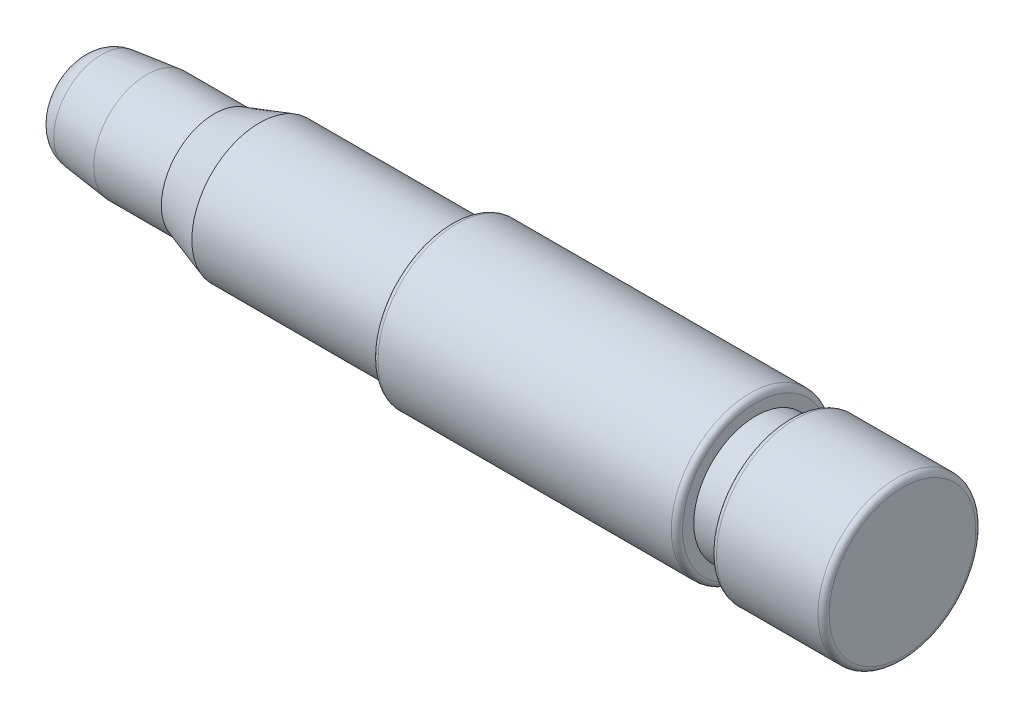
ISO-10303-21;
HEADER;
FILE_DESCRIPTION(('STEP AP214'),'2;1');
FILE_NAME('part.step','',(''),(''),'','','');
FILE_SCHEMA(('AUTOMOTIVE_DESIGN { 1 0 10303 214 1 1 1 1 }'));
ENDSEC;
DATA;
#1=APPLICATION_CONTEXT('core data for automotive mechanical design processes');
#2=APPLICATION_PROTOCOL_DEFINITION('international standard','automotive_design',2000,#1);
#3=PRODUCT_CONTEXT('',#1,'mechanical');
#4=PRODUCT('Part','Part','',(#3));
#5=PRODUCT_RELATED_PRODUCT_CATEGORY('part','',(#4));
#6=PRODUCT_DEFINITION_FORMATION('','',#4);
#7=PRODUCT_DEFINITION_CONTEXT('part definition',#1,'design');
#8=PRODUCT_DEFINITION('design','',#6,#7);
#9=PRODUCT_DEFINITION_SHAPE('','',#8);
#10=(LENGTH_UNIT() NAMED_UNIT(*) SI_UNIT(.MILLI.,.METRE.));
#11=(NAMED_UNIT(*) PLANE_ANGLE_UNIT() SI_UNIT($,.RADIAN.));
#12=(NAMED_UNIT(*) SI_UNIT($,.STERADIAN.) SOLID_ANGLE_UNIT());
#13=UNCERTAINTY_MEASURE_WITH_UNIT(LENGTH_MEASURE(1.E-05),#10,'distance_accuracy_value','');
#14=(GEOMETRIC_REPRESENTATION_CONTEXT(3) GLOBAL_UNCERTAINTY_ASSIGNED_CONTEXT((#13)) GLOBAL_UNIT_ASSIGNED_CONTEXT((#10,
#11,#12)) REPRESENTATION_CONTEXT('',''));
#15=CARTESIAN_POINT('',(0.,0.,0.));
#16=DIRECTION('',(0.,0.,1.));
#17=DIRECTION('',(1.,0.,0.));
#18=AXIS2_PLACEMENT_3D('',#15,#16,#17);
#19=CARTESIAN_POINT('',(0.,3.99999999999998,0.));
#20=DIRECTION('',(1.,0.,0.));
#21=DIRECTION('',(0.,0.,-0.999999999999998));
#22=AXIS2_PLACEMENT_3D('',#19,#20,#21);
#23=PLANE('',#22);
#24=CARTESIAN_POINT('',(0.,0.,0.));
#25=DIRECTION('',(1.,0.,0.));
#26=DIRECTION('',(0.,0.,-0.999999999999998));
#27=AXIS2_PLACEMENT_3D('',#24,#25,#26);
#28=CIRCLE('',#27,1.99723925341916);
#29=CARTESIAN_POINT('',(0.,0.,-1.99723925341915));
#30=VERTEX_POINT('',#29);
#31=EDGE_CURVE('E71',#30,#30,#28,.F.);
#32=ORIENTED_EDGE('',*,*,#31,.T.);
#33=EDGE_LOOP('',(#32));
#34=FACE_BOUND('',#33,.T.);
#35=CARTESIAN_POINT('',(0.,0.,0.));
#36=DIRECTION('',(-1.,0.,0.));
#37=DIRECTION('',(0.,0.,0.999999999999998));
#38=AXIS2_PLACEMENT_3D('',#35,#36,#37);
#39=CIRCLE('',#38,1.5);
#40=CARTESIAN_POINT('',(0.,0.,1.5));
#41=VERTEX_POINT('',#40);
#42=EDGE_CURVE('E93',#41,#41,#39,.T.);
#43=ORIENTED_EDGE('',*,*,#42,.F.);
#44=EDGE_LOOP('',(#43));
#45=FACE_BOUND('',#44,.T.);
#46=ADVANCED_FACE('F36',(#34,#45),#23,.F.);
#47=CARTESIAN_POINT('',(73.,0.,0.));
#48=DIRECTION('',(-1.,0.,0.));
#49=DIRECTION('',(0.,0.,0.999999999999998));
#50=AXIS2_PLACEMENT_3D('',#47,#48,#49);
#51=PLANE('',#50);
#52=CARTESIAN_POINT('',(73.,0.,0.));
#53=DIRECTION('',(-1.,0.,0.));
#54=DIRECTION('',(0.,0.,0.999999999999998));
#55=AXIS2_PLACEMENT_3D('',#52,#53,#54);
#56=CIRCLE('',#55,6.5);
#57=CARTESIAN_POINT('',(73.,0.,6.49999999999999));
#58=VERTEX_POINT('',#57);
#59=EDGE_CURVE('E10',#58,#58,#56,.F.);
#60=ORIENTED_EDGE('',*,*,#59,.T.);
#61=EDGE_LOOP('',(#60));
#62=FACE_BOUND('',#61,.T.);
#63=ADVANCED_FACE('F109',(#62),#51,.F.);
#64=CARTESIAN_POINT('',(0.,0.,0.));
#65=DIRECTION('',(-1.,0.,0.));
#66=DIRECTION('',(0.,0.,0.999999999999998));
#67=AXIS2_PLACEMENT_3D('',#64,#65,#66);
#68=CYLINDRICAL_SURFACE('',#67,7.);
#69=CARTESIAN_POINT('',(63.5,0.,0.));
#70=DIRECTION('',(1.,0.,0.));
#71=DIRECTION('',(0.,0.,-0.999999999999998));
#72=AXIS2_PLACEMENT_3D('',#69,#70,#71);
#73=CIRCLE('',#72,7.);
#74=CARTESIAN_POINT('',(63.5,0.,-6.99999999999999));
#75=VERTEX_POINT('',#74);
#76=EDGE_CURVE('E43',#75,#75,#73,.T.);
#77=ORIENTED_EDGE('',*,*,#76,.T.);
#78=EDGE_LOOP('',(#77));
#79=FACE_BOUND('',#78,.T.);
#80=CARTESIAN_POINT('',(72.5,0.,0.));
#81=DIRECTION('',(-1.,0.,0.));
#82=DIRECTION('',(0.,0.,0.999999999999998));
#83=AXIS2_PLACEMENT_3D('',#80,#81,#82);
#84=CIRCLE('',#83,7.);
#85=CARTESIAN_POINT('',(72.5,0.,6.99999999999999));
#86=VERTEX_POINT('',#85);
#87=EDGE_CURVE('E47',#86,#86,#84,.T.);
#88=ORIENTED_EDGE('',*,*,#87,.T.);
#89=EDGE_LOOP('',(#88));
#90=FACE_BOUND('',#89,.T.);
#91=ADVANCED_FACE('F115',(#79,#90),#68,.T.);
#92=CARTESIAN_POINT('',(63.,7.00000000000001,0.));
#93=DIRECTION('',(1.,0.,0.));
#94=DIRECTION('',(0.,0.,-0.999999999999998));
#95=AXIS2_PLACEMENT_3D('',#92,#93,#94);
#96=PLANE('',#95);
#97=CARTESIAN_POINT('',(63.,0.,0.));
#98=DIRECTION('',(1.,0.,0.));
#99=DIRECTION('',(0.,0.,-0.999999999999998));
#100=AXIS2_PLACEMENT_3D('',#97,#98,#99);
#101=CIRCLE('',#100,6.5);
#102=CARTESIAN_POINT('',(63.,0.,-6.49999999999999));
#103=VERTEX_POINT('',#102);
#104=EDGE_CURVE('E51',#103,#103,#101,.F.);
#105=ORIENTED_EDGE('',*,*,#104,.T.);
#106=EDGE_LOOP('',(#105));
#107=FACE_BOUND('',#106,.T.);
#108=CARTESIAN_POINT('',(63.,0.,0.));
#109=DIRECTION('',(-1.,0.,0.));
#110=DIRECTION('',(0.,0.,0.999999999999998));
#111=AXIS2_PLACEMENT_3D('',#108,#109,#110);
#112=CIRCLE('',#111,5.5);
#113=CARTESIAN_POINT('',(63.,0.,5.49999999999999));
#114=VERTEX_POINT('',#113);
#115=EDGE_CURVE('E74',#114,#114,#112,.T.);
#116=ORIENTED_EDGE('',*,*,#115,.F.);
#117=EDGE_LOOP('',(#116));
#118=FACE_BOUND('',#117,.T.);
#119=ADVANCED_FACE('F140',(#107,#118),#96,.F.);
#120=CARTESIAN_POINT('',(0.,0.,0.));
#121=DIRECTION('',(-1.,0.,0.));
#122=DIRECTION('',(0.,0.,0.999999999999998));
#123=AXIS2_PLACEMENT_3D('',#120,#121,#122);
#124=CYLINDRICAL_SURFACE('',#123,5.5);
#125=CARTESIAN_POINT('',(60.,0.,0.));
#126=DIRECTION('',(-1.,0.,0.));
#127=DIRECTION('',(0.,0.,0.999999999999998));
#128=AXIS2_PLACEMENT_3D('',#125,#126,#127);
#129=CIRCLE('',#128,5.5);
#130=CARTESIAN_POINT('',(60.,0.,5.49999999999999));
#131=VERTEX_POINT('',#130);
#132=EDGE_CURVE('E77',#131,#131,#129,.T.);
#133=ORIENTED_EDGE('',*,*,#132,.F.);
#134=EDGE_LOOP('',(#133));
#135=FACE_BOUND('',#134,.T.);
#136=ORIENTED_EDGE('',*,*,#115,.T.);
#137=EDGE_LOOP('',(#136));
#138=FACE_BOUND('',#137,.T.);
#139=ADVANCED_FACE('F143',(#135,#138),#124,.T.);
#140=CARTESIAN_POINT('',(60.,5.49999999999999,0.));
#141=DIRECTION('',(-1.,0.,0.));
#142=DIRECTION('',(0.,0.,0.999999999999998));
#143=AXIS2_PLACEMENT_3D('',#140,#141,#142);
#144=PLANE('',#143);
#145=CARTESIAN_POINT('',(60.,0.,0.));
#146=DIRECTION('',(-1.,0.,0.));
#147=DIRECTION('',(0.,0.,0.999999999999998));
#148=AXIS2_PLACEMENT_3D('',#145,#146,#147);
#149=CIRCLE('',#148,6.5);
#150=CARTESIAN_POINT('',(60.,0.,6.49999999999999));
#151=VERTEX_POINT('',#150);
#152=EDGE_CURVE('E56',#151,#151,#149,.F.);
#153=ORIENTED_EDGE('',*,*,#152,.T.);
#154=EDGE_LOOP('',(#153));
#155=FACE_BOUND('',#154,.T.);
#156=ORIENTED_EDGE('',*,*,#132,.T.);
#157=EDGE_LOOP('',(#156));
#158=FACE_BOUND('',#157,.T.);
#159=ADVANCED_FACE('F148',(#155,#158),#144,.F.);
#160=CARTESIAN_POINT('',(0.,0.,0.));
#161=DIRECTION('',(-1.,0.,0.));
#162=DIRECTION('',(0.,0.,0.999999999999998));
#163=AXIS2_PLACEMENT_3D('',#160,#161,#162);
#164=CYLINDRICAL_SURFACE('',#163,7.);
#165=CARTESIAN_POINT('',(33.5,0.,0.));
#166=DIRECTION('',(1.,0.,0.));
#167=DIRECTION('',(0.,0.,-0.999999999999998));
#168=AXIS2_PLACEMENT_3D('',#165,#166,#167);
#169=CIRCLE('',#168,7.);
#170=CARTESIAN_POINT('',(33.5,0.,-6.99999999999999));
#171=VERTEX_POINT('',#170);
#172=EDGE_CURVE('E59',#171,#171,#169,.T.);
#173=ORIENTED_EDGE('',*,*,#172,.T.);
#174=EDGE_LOOP('',(#173));
#175=FACE_BOUND('',#174,.T.);
#176=CARTESIAN_POINT('',(59.5,0.,0.));
#177=DIRECTION('',(-1.,0.,0.));
#178=DIRECTION('',(0.,0.,0.999999999999998));
#179=AXIS2_PLACEMENT_3D('',#176,#177,#178);
#180=CIRCLE('',#179,7.);
#181=CARTESIAN_POINT('',(59.5,0.,6.99999999999999));
#182=VERTEX_POINT('',#181);
#183=EDGE_CURVE('E62',#182,#182,#180,.T.);
#184=ORIENTED_EDGE('',*,*,#183,.T.);
#185=EDGE_LOOP('',(#184));
#186=FACE_BOUND('',#185,.T.);
#187=ADVANCED_FACE('F154',(#175,#186),#164,.T.);
#188=CARTESIAN_POINT('',(33.,7.00000000000001,0.));
#189=DIRECTION('',(1.,0.,0.));
#190=DIRECTION('',(0.,0.,-0.999999999999998));
#191=AXIS2_PLACEMENT_3D('',#188,#189,#190);
#192=PLANE('',#191);
#193=CARTESIAN_POINT('',(33.,0.,0.));
#194=DIRECTION('',(1.,0.,0.));
#195=DIRECTION('',(0.,0.,-0.999999999999998));
#196=AXIS2_PLACEMENT_3D('',#193,#194,#195);
#197=CIRCLE('',#196,6.5);
#198=CARTESIAN_POINT('',(33.,0.,-6.49999999999999));
#199=VERTEX_POINT('',#198);
#200=EDGE_CURVE('E65',#199,#199,#197,.F.);
#201=ORIENTED_EDGE('',*,*,#200,.T.);
#202=EDGE_LOOP('',(#201));
#203=FACE_BOUND('',#202,.T.);
#204=CARTESIAN_POINT('',(33.,0.,0.));
#205=DIRECTION('',(-1.,0.,0.));
#206=DIRECTION('',(0.,0.,0.999999999999998));
#207=AXIS2_PLACEMENT_3D('',#204,#205,#206);
#208=CIRCLE('',#207,6.);
#209=CARTESIAN_POINT('',(33.,0.,5.99999999999999));
#210=VERTEX_POINT('',#209);
#211=EDGE_CURVE('E80',#210,#210,#208,.T.);
#212=ORIENTED_EDGE('',*,*,#211,.F.);
#213=EDGE_LOOP('',(#212));
#214=FACE_BOUND('',#213,.T.);
#215=ADVANCED_FACE('F192',(#203,#214),#192,.F.);
#216=CARTESIAN_POINT('',(0.,0.,0.));
#217=DIRECTION('',(-1.,0.,0.));
#218=DIRECTION('',(0.,0.,0.999999999999998));
#219=AXIS2_PLACEMENT_3D('',#216,#217,#218);
#220=CYLINDRICAL_SURFACE('',#219,6.);
#221=CARTESIAN_POINT('',(16.,0.,0.));
#222=DIRECTION('',(-1.,0.,0.));
#223=DIRECTION('',(0.,0.,0.999999999999998));
#224=AXIS2_PLACEMENT_3D('',#221,#222,#223);
#225=CIRCLE('',#224,6.);
#226=CARTESIAN_POINT('',(16.,0.,5.99999999999999));
#227=VERTEX_POINT('',#226);
#228=EDGE_CURVE('E83',#227,#227,#225,.T.);
#229=ORIENTED_EDGE('',*,*,#228,.F.);
#230=EDGE_LOOP('',(#229));
#231=FACE_BOUND('',#230,.T.);
#232=ORIENTED_EDGE('',*,*,#211,.T.);
#233=EDGE_LOOP('',(#232));
#234=FACE_BOUND('',#233,.T.);
#235=ADVANCED_FACE('F200',(#231,#234),#220,.T.);
#236=CARTESIAN_POINT('',(16.,0.,0.));
#237=DIRECTION('',(1.,0.,0.));
#238=DIRECTION('',(0.,0.,-0.999999999999998));
#239=AXIS2_PLACEMENT_3D('',#236,#237,#238);
#240=CONICAL_SURFACE('',#239,6.,0.314231899084338);
#241=CARTESIAN_POINT('',(12.,0.,0.));
#242=DIRECTION('',(-1.,0.,0.));
#243=DIRECTION('',(0.,0.,0.999999999999998));
#244=AXIS2_PLACEMENT_3D('',#241,#242,#243);
#245=CIRCLE('',#244,4.7);
#246=CARTESIAN_POINT('',(12.,0.,4.69999999999999));
#247=VERTEX_POINT('',#246);
#248=EDGE_CURVE('E86',#247,#247,#245,.T.);
#249=ORIENTED_EDGE('',*,*,#248,.F.);
#250=EDGE_LOOP('',(#249));
#251=FACE_BOUND('',#250,.T.);
#252=ORIENTED_EDGE('',*,*,#228,.T.);
#253=EDGE_LOOP('',(#252));
#254=FACE_BOUND('',#253,.T.);
#255=ADVANCED_FACE('F210',(#251,#254),#240,.T.);
#256=CARTESIAN_POINT('',(0.,0.,0.));
#257=DIRECTION('',(-1.,0.,0.));
#258=DIRECTION('',(0.,0.,0.999999999999998));
#259=AXIS2_PLACEMENT_3D('',#256,#257,#258);
#260=CYLINDRICAL_SURFACE('',#259,4.7);
#261=CARTESIAN_POINT('',(6.,0.,0.));
#262=DIRECTION('',(-1.,0.,0.));
#263=DIRECTION('',(0.,0.,0.999999999999998));
#264=AXIS2_PLACEMENT_3D('',#261,#262,#263);
#265=CIRCLE('',#264,4.7);
#266=CARTESIAN_POINT('',(6.,0.,4.69999999999999));
#267=VERTEX_POINT('',#266);
#268=EDGE_CURVE('E89',#267,#267,#265,.T.);
#269=ORIENTED_EDGE('',*,*,#268,.F.);
#270=EDGE_LOOP('',(#269));
#271=FACE_BOUND('',#270,.T.);
#272=ORIENTED_EDGE('',*,*,#248,.T.);
#273=EDGE_LOOP('',(#272));
#274=FACE_BOUND('',#273,.T.);
#275=ADVANCED_FACE('F220',(#271,#274),#260,.T.);
#276=CARTESIAN_POINT('',(6.,0.,0.));
#277=DIRECTION('',(1.,0.,0.));
#278=DIRECTION('',(0.,0.,-0.999999999999998));
#279=AXIS2_PLACEMENT_3D('',#276,#277,#278);
#280=CONICAL_SURFACE('',#279,4.7,0.11614162687999);
#281=CARTESIAN_POINT('',(1.9892684259896,0.,0.));
#282=DIRECTION('',(-1.,0.,0.));
#283=DIRECTION('',(0.,0.,0.999999999999998));
#284=AXIS2_PLACEMENT_3D('',#281,#282,#283);
#285=CIRCLE('',#284,4.23208131636545);
#286=CARTESIAN_POINT('',(1.9892684259896,0.,4.23208131636545));
#287=VERTEX_POINT('',#286);
#288=EDGE_CURVE('E68',#287,#287,#285,.F.);
#289=ORIENTED_EDGE('',*,*,#288,.T.);
#290=EDGE_LOOP('',(#289));
#291=FACE_BOUND('',#290,.T.);
#292=ORIENTED_EDGE('',*,*,#268,.T.);
#293=EDGE_LOOP('',(#292));
#294=FACE_BOUND('',#293,.T.);
#295=ADVANCED_FACE('F104',(#291,#294),#280,.T.);
#296=CARTESIAN_POINT('',(3.,0.,0.));
#297=DIRECTION('',(-1.,0.,0.));
#298=DIRECTION('',(0.,0.,0.999999999999998));
#299=AXIS2_PLACEMENT_3D('',#296,#297,#298);
#300=CYLINDRICAL_SURFACE('',#299,1.5);
#301=CARTESIAN_POINT('',(3.,0.,0.));
#302=DIRECTION('',(-1.,0.,0.));
#303=DIRECTION('',(0.,0.,0.999999999999998));
#304=AXIS2_PLACEMENT_3D('',#301,#302,#303);
#305=CIRCLE('',#304,1.5);
#306=CARTESIAN_POINT('',(3.,0.,1.5));
#307=VERTEX_POINT('',#306);
#308=EDGE_CURVE('E92',#307,#307,#305,.T.);
#309=ORIENTED_EDGE('',*,*,#308,.F.);
#310=EDGE_LOOP('',(#309));
#311=FACE_BOUND('',#310,.T.);
#312=ORIENTED_EDGE('',*,*,#42,.T.);
#313=EDGE_LOOP('',(#312));
#314=FACE_BOUND('',#313,.T.);
#315=ADVANCED_FACE('F101',(#311,#314),#300,.F.);
#316=CARTESIAN_POINT('',(3.,0.,0.));
#317=DIRECTION('',(-1.,0.,0.));
#318=DIRECTION('',(0.,0.,0.999999999999998));
#319=AXIS2_PLACEMENT_3D('',#316,#317,#318);
#320=PLANE('',#319);
#321=ORIENTED_EDGE('',*,*,#308,.T.);
#322=EDGE_LOOP('',(#321));
#323=FACE_BOUND('',#322,.T.);
#324=ADVANCED_FACE('F99',(#323),#320,.T.);
#325=CARTESIAN_POINT('',(2.25,0.,0.));
#326=DIRECTION('',(1.,0.,0.));
#327=DIRECTION('',(0.,0.,-0.999999999999998));
#328=AXIS2_PLACEMENT_3D('',#325,#326,#327);
#329=DEGENERATE_TOROIDAL_SURFACE('',#328,1.99723925341916,2.25,.T.);
#330=ORIENTED_EDGE('',*,*,#288,.F.);
#331=EDGE_LOOP('',(#330));
#332=FACE_BOUND('',#331,.T.);
#333=ORIENTED_EDGE('',*,*,#31,.F.);
#334=EDGE_LOOP('',(#333));
#335=FACE_BOUND('',#334,.T.);
#336=ADVANCED_FACE('F119',(#332,#335),#329,.T.);
#337=CARTESIAN_POINT('',(33.5,0.,0.));
#338=DIRECTION('',(1.,0.,0.));
#339=DIRECTION('',(0.,0.,-0.999999999999998));
#340=AXIS2_PLACEMENT_3D('',#337,#338,#339);
#341=TOROIDAL_SURFACE('',#340,6.5,0.5);
#342=ORIENTED_EDGE('',*,*,#172,.F.);
#343=EDGE_LOOP('',(#342));
#344=FACE_BOUND('',#343,.T.);
#345=ORIENTED_EDGE('',*,*,#200,.F.);
#346=EDGE_LOOP('',(#345));
#347=FACE_BOUND('',#346,.T.);
#348=ADVANCED_FACE('F122',(#344,#347),#341,.T.);
#349=CARTESIAN_POINT('',(59.5,0.,0.));
#350=DIRECTION('',(-1.,0.,0.));
#351=DIRECTION('',(0.,0.,0.999999999999998));
#352=AXIS2_PLACEMENT_3D('',#349,#350,#351);
#353=TOROIDAL_SURFACE('',#352,6.5,0.5);
#354=ORIENTED_EDGE('',*,*,#152,.F.);
#355=EDGE_LOOP('',(#354));
#356=FACE_BOUND('',#355,.T.);
#357=ORIENTED_EDGE('',*,*,#183,.F.);
#358=EDGE_LOOP('',(#357));
#359=FACE_BOUND('',#358,.T.);
#360=ADVANCED_FACE('F126',(#356,#359),#353,.T.);
#361=CARTESIAN_POINT('',(63.5,0.,0.));
#362=DIRECTION('',(1.,0.,0.));
#363=DIRECTION('',(0.,0.,-0.999999999999998));
#364=AXIS2_PLACEMENT_3D('',#361,#362,#363);
#365=TOROIDAL_SURFACE('',#364,6.5,0.5);
#366=ORIENTED_EDGE('',*,*,#76,.F.);
#367=EDGE_LOOP('',(#366));
#368=FACE_BOUND('',#367,.T.);
#369=ORIENTED_EDGE('',*,*,#104,.F.);
#370=EDGE_LOOP('',(#369));
#371=FACE_BOUND('',#370,.T.);
#372=ADVANCED_FACE('F129',(#368,#371),#365,.T.);
#373=CARTESIAN_POINT('',(72.5,0.,0.));
#374=DIRECTION('',(-1.,0.,0.));
#375=DIRECTION('',(0.,0.,0.999999999999998));
#376=AXIS2_PLACEMENT_3D('',#373,#374,#375);
#377=TOROIDAL_SURFACE('',#376,6.5,0.5);
#378=ORIENTED_EDGE('',*,*,#59,.F.);
#379=EDGE_LOOP('',(#378));
#380=FACE_BOUND('',#379,.T.);
#381=ORIENTED_EDGE('',*,*,#87,.F.);
#382=EDGE_LOOP('',(#381));
#383=FACE_BOUND('',#382,.T.);
#384=ADVANCED_FACE('F38',(#380,#383),#377,.T.);
#385=CLOSED_SHELL('',(#46,#63,#91,#119,#139,#159,#187,#215,#235,#255,#275,#295,#315,#324,#336,
#348,#360,#372,#384));
#386=MANIFOLD_SOLID_BREP('B2',#385);
#387=ADVANCED_BREP_SHAPE_REPRESENTATION('',(#18,#386),#14);
#388=SHAPE_DEFINITION_REPRESENTATION(#9,#387);
ENDSEC;
END-ISO-10303-21;
